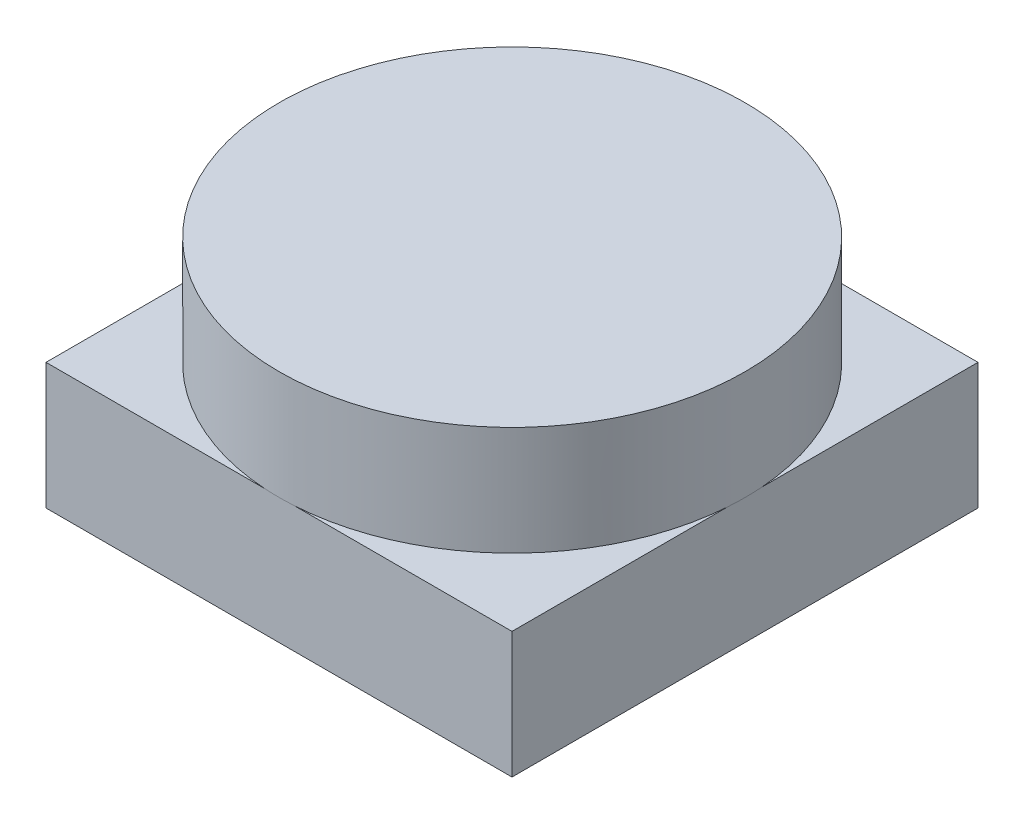
ISO-10303-21;
HEADER;
FILE_DESCRIPTION(('STEP AP214'),'2;1');
FILE_NAME('part.step','',(''),(''),'','','');
FILE_SCHEMA(('AUTOMOTIVE_DESIGN { 1 0 10303 214 1 1 1 1 }'));
ENDSEC;
DATA;
#1=APPLICATION_CONTEXT('core data for automotive mechanical design processes');
#2=APPLICATION_PROTOCOL_DEFINITION('international standard','automotive_design',2000,#1);
#3=PRODUCT_CONTEXT('',#1,'mechanical');
#4=PRODUCT('Part','Part','',(#3));
#5=PRODUCT_RELATED_PRODUCT_CATEGORY('part','',(#4));
#6=PRODUCT_DEFINITION_FORMATION('','',#4);
#7=PRODUCT_DEFINITION_CONTEXT('part definition',#1,'design');
#8=PRODUCT_DEFINITION('design','',#6,#7);
#9=PRODUCT_DEFINITION_SHAPE('','',#8);
#10=(LENGTH_UNIT() NAMED_UNIT(*) SI_UNIT(.MILLI.,.METRE.));
#11=(NAMED_UNIT(*) PLANE_ANGLE_UNIT() SI_UNIT($,.RADIAN.));
#12=(NAMED_UNIT(*) SI_UNIT($,.STERADIAN.) SOLID_ANGLE_UNIT());
#13=UNCERTAINTY_MEASURE_WITH_UNIT(LENGTH_MEASURE(1.E-05),#10,'distance_accuracy_value','');
#14=(GEOMETRIC_REPRESENTATION_CONTEXT(3) GLOBAL_UNCERTAINTY_ASSIGNED_CONTEXT((#13)) GLOBAL_UNIT_ASSIGNED_CONTEXT((#10,
#11,#12)) REPRESENTATION_CONTEXT('',''));
#15=CARTESIAN_POINT('',(0.,0.,0.));
#16=DIRECTION('',(0.,0.,1.));
#17=DIRECTION('',(1.,0.,0.));
#18=AXIS2_PLACEMENT_3D('',#15,#16,#17);
#19=CARTESIAN_POINT('',(0.,20.85,0.));
#20=DIRECTION('',(0.,1.,0.));
#21=DIRECTION('',(0.,0.,1.));
#22=AXIS2_PLACEMENT_3D('',#19,#20,#21);
#23=PLANE('',#22);
#24=CARTESIAN_POINT('',(4.50000496338841,20.85,0.922846441947567));
#25=DIRECTION('',(0.,1.,0.));
#26=DIRECTION('',(0.,0.,1.));
#27=AXIS2_PLACEMENT_3D('',#24,#25,#26);
#28=CIRCLE('',#27,38.5);
#29=CARTESIAN_POINT('',(6.94977330961622,20.85,39.3448275862069));
#30=VERTEX_POINT('',#29);
#31=CARTESIAN_POINT('',(42.8974664698387,20.85,3.73086173048683));
#32=VERTEX_POINT('',#31);
#33=EDGE_CURVE('E47',#30,#32,#28,.T.);
#34=ORIENTED_EDGE('',*,*,#33,.F.);
#35=DIRECTION('',(1.,0.,0.));
#36=VECTOR('',#35,1.);
#37=CARTESIAN_POINT('',(-34.1025335301613,20.85,39.3448275862069));
#38=LINE('',#37,#36);
#39=CARTESIAN_POINT('',(42.8974664698387,20.85,39.3448275862069));
#40=VERTEX_POINT('',#39);
#41=EDGE_CURVE('E101',#30,#40,#38,.T.);
#42=ORIENTED_EDGE('',*,*,#41,.T.);
#43=DIRECTION('',(0.,0.,-1.));
#44=VECTOR('',#43,1.);
#45=CARTESIAN_POINT('',(42.8974664698387,20.85,-37.6551724137931));
#46=LINE('',#45,#44);
#47=EDGE_CURVE('E122',#40,#32,#46,.T.);
#48=ORIENTED_EDGE('',*,*,#47,.T.);
#49=EDGE_LOOP('',(#34,#42,#48));
#50=FACE_BOUND('',#49,.T.);
#51=ADVANCED_FACE('F37',(#50),#23,.T.);
#52=CARTESIAN_POINT('',(-34.1025335301613,20.85,-37.6551724137931));
#53=DIRECTION('',(1.,0.,0.));
#54=DIRECTION('',(0.,0.,-1.));
#55=AXIS2_PLACEMENT_3D('',#52,#53,#54);
#56=PLANE('',#55);
#57=DIRECTION('',(0.,0.,1.));
#58=VECTOR('',#57,1.);
#59=CARTESIAN_POINT('',(-34.1025335301613,0.,-37.6551724137931));
#60=LINE('',#59,#58);
#61=CARTESIAN_POINT('',(-34.1025335301613,0.,-37.6551724137931));
#62=VERTEX_POINT('',#61);
#63=CARTESIAN_POINT('',(-34.1025335301613,0.,39.3448275862069));
#64=VERTEX_POINT('',#63);
#65=EDGE_CURVE('E127',#62,#64,#60,.T.);
#66=ORIENTED_EDGE('',*,*,#65,.T.);
#67=DIRECTION('',(0.,-1.,0.));
#68=VECTOR('',#67,1.);
#69=CARTESIAN_POINT('',(-34.1025335301613,20.85,39.3448275862069));
#70=LINE('',#69,#68);
#71=CARTESIAN_POINT('',(-34.1025335301613,20.85,39.3448275862069));
#72=VERTEX_POINT('',#71);
#73=EDGE_CURVE('E41',#72,#64,#70,.T.);
#74=ORIENTED_EDGE('',*,*,#73,.F.);
#75=DIRECTION('',(0.,0.,1.));
#76=VECTOR('',#75,1.);
#77=CARTESIAN_POINT('',(-34.1025335301613,20.85,-37.6551724137931));
#78=LINE('',#77,#76);
#79=CARTESIAN_POINT('',(-34.1025335301613,20.85,-37.6551724137931));
#80=VERTEX_POINT('',#79);
#81=EDGE_CURVE('E94',#80,#72,#78,.T.);
#82=ORIENTED_EDGE('',*,*,#81,.F.);
#83=DIRECTION('',(0.,-1.,0.));
#84=VECTOR('',#83,1.);
#85=CARTESIAN_POINT('',(-34.1025335301613,20.85,-37.6551724137931));
#86=LINE('',#85,#84);
#87=EDGE_CURVE('E126',#80,#62,#86,.T.);
#88=ORIENTED_EDGE('',*,*,#87,.T.);
#89=EDGE_LOOP('',(#66,#74,#82,#88));
#90=FACE_BOUND('',#89,.T.);
#91=ADVANCED_FACE('F39',(#90),#56,.F.);
#92=CARTESIAN_POINT('',(-34.1025335301613,20.85,39.3448275862069));
#93=DIRECTION('',(0.,0.,-1.));
#94=DIRECTION('',(-1.,0.,0.));
#95=AXIS2_PLACEMENT_3D('',#92,#93,#94);
#96=PLANE('',#95);
#97=DIRECTION('',(1.,0.,0.));
#98=VECTOR('',#97,1.);
#99=CARTESIAN_POINT('',(-34.1025335301613,0.,39.3448275862069));
#100=LINE('',#99,#98);
#101=CARTESIAN_POINT('',(42.8974664698387,0.,39.3448275862069));
#102=VERTEX_POINT('',#101);
#103=EDGE_CURVE('E130',#64,#102,#100,.T.);
#104=ORIENTED_EDGE('',*,*,#103,.T.);
#105=DIRECTION('',(0.,-1.,0.));
#106=VECTOR('',#105,1.);
#107=CARTESIAN_POINT('',(42.8974664698387,20.85,39.3448275862069));
#108=LINE('',#107,#106);
#109=EDGE_CURVE('E139',#40,#102,#108,.T.);
#110=ORIENTED_EDGE('',*,*,#109,.F.);
#111=ORIENTED_EDGE('',*,*,#41,.F.);
#112=CARTESIAN_POINT('',(2.05023661716061,20.85,39.3448275862069));
#113=VERTEX_POINT('',#112);
#114=EDGE_CURVE('E99',#113,#30,#38,.T.);
#115=ORIENTED_EDGE('',*,*,#114,.F.);
#116=EDGE_CURVE('E90',#72,#113,#38,.T.);
#117=ORIENTED_EDGE('',*,*,#116,.F.);
#118=ORIENTED_EDGE('',*,*,#73,.T.);
#119=EDGE_LOOP('',(#104,#110,#111,#115,#117,#118));
#120=FACE_BOUND('',#119,.T.);
#121=ADVANCED_FACE('F105',(#120),#96,.F.);
#122=CARTESIAN_POINT('',(42.8974664698387,20.85,-37.6551724137931));
#123=DIRECTION('',(-1.,0.,0.));
#124=DIRECTION('',(0.,0.,1.));
#125=AXIS2_PLACEMENT_3D('',#122,#123,#124);
#126=PLANE('',#125);
#127=DIRECTION('',(0.,0.,-1.));
#128=VECTOR('',#127,1.);
#129=CARTESIAN_POINT('',(42.8974664698387,0.,-37.6551724137931));
#130=LINE('',#129,#128);
#131=CARTESIAN_POINT('',(42.8974664698387,0.,-37.6551724137931));
#132=VERTEX_POINT('',#131);
#133=EDGE_CURVE('E132',#102,#132,#130,.T.);
#134=ORIENTED_EDGE('',*,*,#133,.T.);
#135=DIRECTION('',(0.,-1.,0.));
#136=VECTOR('',#135,1.);
#137=CARTESIAN_POINT('',(42.8974664698387,20.85,-37.6551724137931));
#138=LINE('',#137,#136);
#139=CARTESIAN_POINT('',(42.8974664698387,20.85,-37.6551724137931));
#140=VERTEX_POINT('',#139);
#141=EDGE_CURVE('E137',#140,#132,#138,.T.);
#142=ORIENTED_EDGE('',*,*,#141,.F.);
#143=CARTESIAN_POINT('',(42.8974664698387,20.85,-1.88516884659171));
#144=VERTEX_POINT('',#143);
#145=EDGE_CURVE('E98',#144,#140,#46,.T.);
#146=ORIENTED_EDGE('',*,*,#145,.F.);
#147=EDGE_CURVE('E60',#32,#144,#46,.T.);
#148=ORIENTED_EDGE('',*,*,#147,.F.);
#149=ORIENTED_EDGE('',*,*,#47,.F.);
#150=ORIENTED_EDGE('',*,*,#109,.T.);
#151=EDGE_LOOP('',(#134,#142,#146,#148,#149,#150));
#152=FACE_BOUND('',#151,.T.);
#153=ADVANCED_FACE('F149',(#152),#126,.F.);
#154=CARTESIAN_POINT('',(-34.1025335301613,20.85,-37.6551724137931));
#155=DIRECTION('',(0.,0.,1.));
#156=DIRECTION('',(1.,0.,0.));
#157=AXIS2_PLACEMENT_3D('',#154,#155,#156);
#158=PLANE('',#157);
#159=DIRECTION('',(-1.,0.,0.));
#160=VECTOR('',#159,1.);
#161=CARTESIAN_POINT('',(-34.1025335301613,0.,-37.6551724137931));
#162=LINE('',#161,#160);
#163=EDGE_CURVE('E120',#132,#62,#162,.T.);
#164=ORIENTED_EDGE('',*,*,#163,.T.);
#165=ORIENTED_EDGE('',*,*,#87,.F.);
#166=DIRECTION('',(-1.,0.,0.));
#167=VECTOR('',#166,1.);
#168=CARTESIAN_POINT('',(-34.1025335301613,20.85,-37.6551724137931));
#169=LINE('',#168,#167);
#170=EDGE_CURVE('E124',#140,#80,#169,.T.);
#171=ORIENTED_EDGE('',*,*,#170,.F.);
#172=ORIENTED_EDGE('',*,*,#141,.T.);
#173=EDGE_LOOP('',(#164,#165,#171,#172));
#174=FACE_BOUND('',#173,.T.);
#175=ADVANCED_FACE('F152',(#174),#158,.F.);
#176=EDGE_CURVE('E11',#144,#113,#28,.T.);
#177=ORIENTED_EDGE('',*,*,#176,.F.);
#178=ORIENTED_EDGE('',*,*,#145,.T.);
#179=ORIENTED_EDGE('',*,*,#170,.T.);
#180=ORIENTED_EDGE('',*,*,#81,.T.);
#181=ORIENTED_EDGE('',*,*,#116,.T.);
#182=EDGE_LOOP('',(#177,#178,#179,#180,#181));
#183=FACE_BOUND('',#182,.T.);
#184=ADVANCED_FACE('F92',(#183),#23,.T.);
#185=CARTESIAN_POINT('',(0.,0.,0.));
#186=DIRECTION('',(0.,1.,0.));
#187=DIRECTION('',(0.,0.,1.));
#188=AXIS2_PLACEMENT_3D('',#185,#186,#187);
#189=PLANE('',#188);
#190=ORIENTED_EDGE('',*,*,#65,.F.);
#191=ORIENTED_EDGE('',*,*,#163,.F.);
#192=ORIENTED_EDGE('',*,*,#133,.F.);
#193=ORIENTED_EDGE('',*,*,#103,.F.);
#194=EDGE_LOOP('',(#190,#191,#192,#193));
#195=FACE_BOUND('',#194,.T.);
#196=ADVANCED_FACE('F147',(#195),#189,.F.);
#197=CARTESIAN_POINT('',(4.50000496338841,20.85,0.922846441947567));
#198=DIRECTION('',(0.,1.,0.));
#199=DIRECTION('',(0.,0.,1.));
#200=AXIS2_PLACEMENT_3D('',#197,#198,#199);
#201=PLANE('',#200);
#202=EDGE_CURVE('E109',#113,#30,#28,.T.);
#203=ORIENTED_EDGE('',*,*,#202,.F.);
#204=ORIENTED_EDGE('',*,*,#114,.T.);
#205=EDGE_LOOP('',(#203,#204));
#206=FACE_BOUND('',#205,.T.);
#207=ADVANCED_FACE('F110',(#206),#201,.F.);
#208=EDGE_CURVE('E48',#32,#144,#28,.T.);
#209=ORIENTED_EDGE('',*,*,#208,.F.);
#210=ORIENTED_EDGE('',*,*,#147,.T.);
#211=EDGE_LOOP('',(#209,#210));
#212=FACE_BOUND('',#211,.T.);
#213=ADVANCED_FACE('F153',(#212),#201,.F.);
#214=CARTESIAN_POINT('',(4.50000496338841,38.85,0.922846441947567));
#215=DIRECTION('',(0.,-1.,0.));
#216=DIRECTION('',(0.,0.,-1.));
#217=AXIS2_PLACEMENT_3D('',#214,#215,#216);
#218=CYLINDRICAL_SURFACE('',#217,38.5);
#219=CARTESIAN_POINT('',(4.50000496338841,38.85,0.922846441947567));
#220=DIRECTION('',(0.,1.,0.));
#221=DIRECTION('',(0.,0.,1.));
#222=AXIS2_PLACEMENT_3D('',#219,#220,#221);
#223=CIRCLE('',#222,38.5);
#224=CARTESIAN_POINT('',(4.50000496338841,38.85,39.4228464419476));
#225=VERTEX_POINT('',#224);
#226=EDGE_CURVE('E117',#225,#225,#223,.T.);
#227=ORIENTED_EDGE('',*,*,#226,.F.);
#228=EDGE_LOOP('',(#227));
#229=FACE_BOUND('',#228,.T.);
#230=ORIENTED_EDGE('',*,*,#33,.T.);
#231=ORIENTED_EDGE('',*,*,#208,.T.);
#232=ORIENTED_EDGE('',*,*,#176,.T.);
#233=ORIENTED_EDGE('',*,*,#202,.T.);
#234=EDGE_LOOP('',(#230,#231,#232,#233));
#235=FACE_BOUND('',#234,.T.);
#236=ADVANCED_FACE('F114',(#229,#235),#218,.T.);
#237=CARTESIAN_POINT('',(4.50000496338841,38.85,0.922846441947567));
#238=DIRECTION('',(0.,1.,0.));
#239=DIRECTION('',(0.,0.,1.));
#240=AXIS2_PLACEMENT_3D('',#237,#238,#239);
#241=PLANE('',#240);
#242=ORIENTED_EDGE('',*,*,#226,.T.);
#243=EDGE_LOOP('',(#242));
#244=FACE_BOUND('',#243,.T.);
#245=ADVANCED_FACE('F160',(#244),#241,.T.);
#246=CLOSED_SHELL('',(#51,#91,#121,#153,#175,#184,#196,#207,#213,#236,#245));
#247=MANIFOLD_SOLID_BREP('B2',#246);
#248=ADVANCED_BREP_SHAPE_REPRESENTATION('',(#18,#247),#14);
#249=SHAPE_DEFINITION_REPRESENTATION(#9,#248);
ENDSEC;
END-ISO-10303-21;
